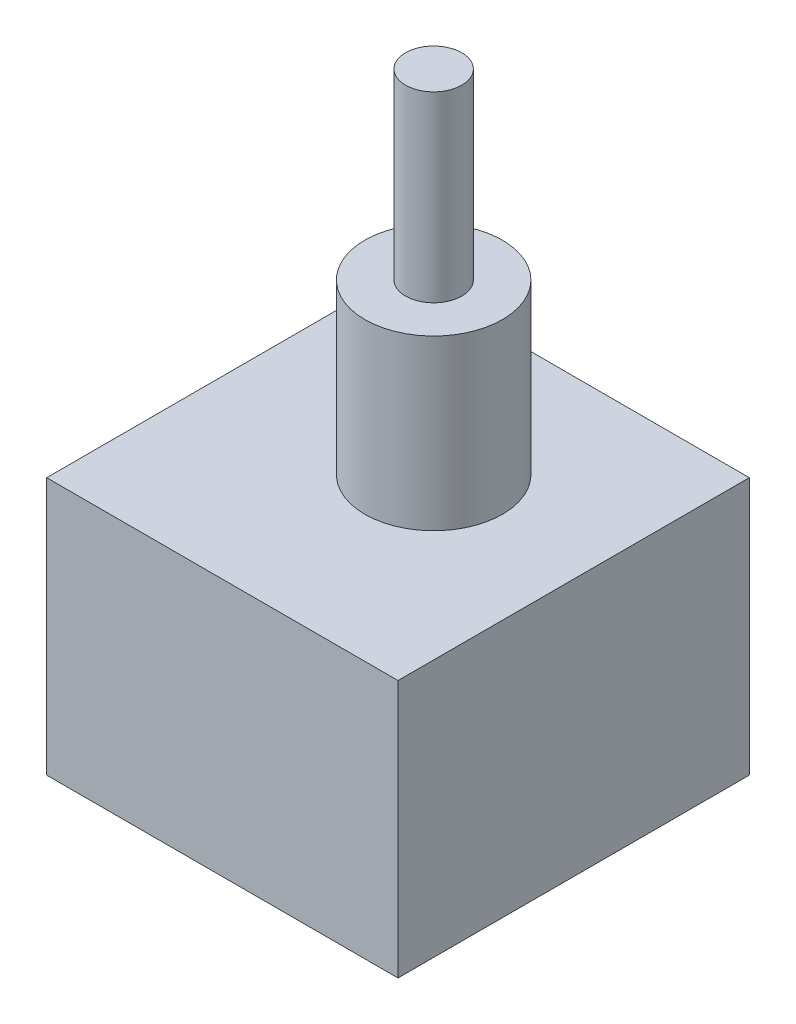
ISO-10303-21;
HEADER;
FILE_DESCRIPTION(('STEP AP214'),'2;1');
FILE_NAME('part.step','',(''),(''),'','','');
FILE_SCHEMA(('AUTOMOTIVE_DESIGN { 1 0 10303 214 1 1 1 1 }'));
ENDSEC;
DATA;
#1=APPLICATION_CONTEXT('core data for automotive mechanical design processes');
#2=APPLICATION_PROTOCOL_DEFINITION('international standard','automotive_design',2000,#1);
#3=PRODUCT_CONTEXT('',#1,'mechanical');
#4=PRODUCT('Part','Part','',(#3));
#5=PRODUCT_RELATED_PRODUCT_CATEGORY('part','',(#4));
#6=PRODUCT_DEFINITION_FORMATION('','',#4);
#7=PRODUCT_DEFINITION_CONTEXT('part definition',#1,'design');
#8=PRODUCT_DEFINITION('design','',#6,#7);
#9=PRODUCT_DEFINITION_SHAPE('','',#8);
#10=(LENGTH_UNIT() NAMED_UNIT(*) SI_UNIT(.MILLI.,.METRE.));
#11=(NAMED_UNIT(*) PLANE_ANGLE_UNIT() SI_UNIT($,.RADIAN.));
#12=(NAMED_UNIT(*) SI_UNIT($,.STERADIAN.) SOLID_ANGLE_UNIT());
#13=UNCERTAINTY_MEASURE_WITH_UNIT(LENGTH_MEASURE(1.E-05),#10,'distance_accuracy_value','');
#14=(GEOMETRIC_REPRESENTATION_CONTEXT(3) GLOBAL_UNCERTAINTY_ASSIGNED_CONTEXT((#13)) GLOBAL_UNIT_ASSIGNED_CONTEXT((#10,
#11,#12)) REPRESENTATION_CONTEXT('',''));
#15=CARTESIAN_POINT('',(0.,0.,0.));
#16=DIRECTION('',(0.,0.,1.));
#17=DIRECTION('',(1.,0.,0.));
#18=AXIS2_PLACEMENT_3D('',#15,#16,#17);
#19=CARTESIAN_POINT('',(-16.2944162436548,22.,-13.248730964467));
#20=DIRECTION('',(1.,0.,0.));
#21=DIRECTION('',(0.,0.,-1.));
#22=AXIS2_PLACEMENT_3D('',#19,#20,#21);
#23=PLANE('',#22);
#24=DIRECTION('',(0.,0.,1.));
#25=VECTOR('',#24,1.);
#26=CARTESIAN_POINT('',(-16.2944162436548,0.,-13.248730964467));
#27=LINE('',#26,#25);
#28=CARTESIAN_POINT('',(-16.2944162436548,0.,-13.248730964467));
#29=VERTEX_POINT('',#28);
#30=CARTESIAN_POINT('',(-16.2944162436548,0.,16.751269035533));
#31=VERTEX_POINT('',#30);
#32=EDGE_CURVE('E116',#29,#31,#27,.T.);
#33=ORIENTED_EDGE('',*,*,#32,.T.);
#34=DIRECTION('',(0.,-1.,0.));
#35=VECTOR('',#34,1.);
#36=CARTESIAN_POINT('',(-16.2944162436548,22.,16.751269035533));
#37=LINE('',#36,#35);
#38=CARTESIAN_POINT('',(-16.2944162436548,22.,16.751269035533));
#39=VERTEX_POINT('',#38);
#40=EDGE_CURVE('E47',#39,#31,#37,.T.);
#41=ORIENTED_EDGE('',*,*,#40,.F.);
#42=DIRECTION('',(0.,0.,1.));
#43=VECTOR('',#42,1.);
#44=CARTESIAN_POINT('',(-16.2944162436548,22.,-13.248730964467));
#45=LINE('',#44,#43);
#46=CARTESIAN_POINT('',(-16.2944162436548,22.,-13.248730964467));
#47=VERTEX_POINT('',#46);
#48=EDGE_CURVE('E99',#47,#39,#45,.T.);
#49=ORIENTED_EDGE('',*,*,#48,.F.);
#50=DIRECTION('',(0.,-1.,0.));
#51=VECTOR('',#50,1.);
#52=CARTESIAN_POINT('',(-16.2944162436548,22.,-13.248730964467));
#53=LINE('',#52,#51);
#54=EDGE_CURVE('E112',#47,#29,#53,.T.);
#55=ORIENTED_EDGE('',*,*,#54,.T.);
#56=EDGE_LOOP('',(#33,#41,#49,#55));
#57=FACE_BOUND('',#56,.T.);
#58=ADVANCED_FACE('F44',(#57),#23,.F.);
#59=CARTESIAN_POINT('',(-16.2944162436548,22.,16.751269035533));
#60=DIRECTION('',(0.,0.,-1.));
#61=DIRECTION('',(-1.,0.,0.));
#62=AXIS2_PLACEMENT_3D('',#59,#60,#61);
#63=PLANE('',#62);
#64=DIRECTION('',(1.,0.,0.));
#65=VECTOR('',#64,1.);
#66=CARTESIAN_POINT('',(-16.2944162436548,0.,16.751269035533));
#67=LINE('',#66,#65);
#68=CARTESIAN_POINT('',(13.7055837563452,0.,16.751269035533));
#69=VERTEX_POINT('',#68);
#70=EDGE_CURVE('E105',#31,#69,#67,.T.);
#71=ORIENTED_EDGE('',*,*,#70,.T.);
#72=DIRECTION('',(0.,-1.,0.));
#73=VECTOR('',#72,1.);
#74=CARTESIAN_POINT('',(13.7055837563452,22.,16.751269035533));
#75=LINE('',#74,#73);
#76=CARTESIAN_POINT('',(13.7055837563452,22.,16.751269035533));
#77=VERTEX_POINT('',#76);
#78=EDGE_CURVE('E103',#77,#69,#75,.T.);
#79=ORIENTED_EDGE('',*,*,#78,.F.);
#80=DIRECTION('',(1.,0.,0.));
#81=VECTOR('',#80,1.);
#82=CARTESIAN_POINT('',(-16.2944162436548,22.,16.751269035533));
#83=LINE('',#82,#81);
#84=EDGE_CURVE('E94',#39,#77,#83,.T.);
#85=ORIENTED_EDGE('',*,*,#84,.F.);
#86=ORIENTED_EDGE('',*,*,#40,.T.);
#87=EDGE_LOOP('',(#71,#79,#85,#86));
#88=FACE_BOUND('',#87,.T.);
#89=ADVANCED_FACE('F104',(#88),#63,.F.);
#90=CARTESIAN_POINT('',(13.7055837563452,22.,-13.248730964467));
#91=DIRECTION('',(-1.,0.,0.));
#92=DIRECTION('',(0.,0.,1.));
#93=AXIS2_PLACEMENT_3D('',#90,#91,#92);
#94=PLANE('',#93);
#95=DIRECTION('',(0.,0.,-1.));
#96=VECTOR('',#95,1.);
#97=CARTESIAN_POINT('',(13.7055837563452,0.,-13.248730964467));
#98=LINE('',#97,#96);
#99=CARTESIAN_POINT('',(13.7055837563452,0.,-13.248730964467));
#100=VERTEX_POINT('',#99);
#101=EDGE_CURVE('E80',#69,#100,#98,.T.);
#102=ORIENTED_EDGE('',*,*,#101,.T.);
#103=DIRECTION('',(0.,-1.,0.));
#104=VECTOR('',#103,1.);
#105=CARTESIAN_POINT('',(13.7055837563452,22.,-13.248730964467));
#106=LINE('',#105,#104);
#107=CARTESIAN_POINT('',(13.7055837563452,22.,-13.248730964467));
#108=VERTEX_POINT('',#107);
#109=EDGE_CURVE('E107',#108,#100,#106,.T.);
#110=ORIENTED_EDGE('',*,*,#109,.F.);
#111=DIRECTION('',(0.,0.,-1.));
#112=VECTOR('',#111,1.);
#113=CARTESIAN_POINT('',(13.7055837563452,22.,-13.248730964467));
#114=LINE('',#113,#112);
#115=EDGE_CURVE('E97',#77,#108,#114,.T.);
#116=ORIENTED_EDGE('',*,*,#115,.F.);
#117=ORIENTED_EDGE('',*,*,#78,.T.);
#118=EDGE_LOOP('',(#102,#110,#116,#117));
#119=FACE_BOUND('',#118,.T.);
#120=ADVANCED_FACE('F108',(#119),#94,.F.);
#121=CARTESIAN_POINT('',(-16.2944162436548,22.,-13.248730964467));
#122=DIRECTION('',(0.,0.,1.));
#123=DIRECTION('',(1.,0.,0.));
#124=AXIS2_PLACEMENT_3D('',#121,#122,#123);
#125=PLANE('',#124);
#126=DIRECTION('',(-1.,0.,0.));
#127=VECTOR('',#126,1.);
#128=CARTESIAN_POINT('',(-16.2944162436548,0.,-13.248730964467));
#129=LINE('',#128,#127);
#130=EDGE_CURVE('E86',#100,#29,#129,.T.);
#131=ORIENTED_EDGE('',*,*,#130,.T.);
#132=ORIENTED_EDGE('',*,*,#54,.F.);
#133=DIRECTION('',(-1.,0.,0.));
#134=VECTOR('',#133,1.);
#135=CARTESIAN_POINT('',(-16.2944162436548,22.,-13.248730964467));
#136=LINE('',#135,#134);
#137=EDGE_CURVE('E63',#108,#47,#136,.T.);
#138=ORIENTED_EDGE('',*,*,#137,.F.);
#139=ORIENTED_EDGE('',*,*,#109,.T.);
#140=EDGE_LOOP('',(#131,#132,#138,#139));
#141=FACE_BOUND('',#140,.T.);
#142=ADVANCED_FACE('F130',(#141),#125,.F.);
#143=CARTESIAN_POINT('',(0.,22.,0.));
#144=DIRECTION('',(0.,1.,0.));
#145=DIRECTION('',(0.,0.,1.));
#146=AXIS2_PLACEMENT_3D('',#143,#144,#145);
#147=PLANE('',#146);
#148=CARTESIAN_POINT('',(0.,22.,0.));
#149=DIRECTION('',(0.,1.,0.));
#150=DIRECTION('',(0.,0.,1.));
#151=AXIS2_PLACEMENT_3D('',#148,#149,#150);
#152=CIRCLE('',#151,5.875);
#153=CARTESIAN_POINT('',(0.,22.,5.875));
#154=VERTEX_POINT('',#153);
#155=EDGE_CURVE('E54',#154,#154,#152,.T.);
#156=ORIENTED_EDGE('',*,*,#155,.F.);
#157=EDGE_LOOP('',(#156));
#158=FACE_BOUND('',#157,.T.);
#159=ORIENTED_EDGE('',*,*,#48,.T.);
#160=ORIENTED_EDGE('',*,*,#84,.T.);
#161=ORIENTED_EDGE('',*,*,#115,.T.);
#162=ORIENTED_EDGE('',*,*,#137,.T.);
#163=EDGE_LOOP('',(#159,#160,#161,#162));
#164=FACE_BOUND('',#163,.T.);
#165=ADVANCED_FACE('F95',(#158,#164),#147,.T.);
#166=CARTESIAN_POINT('',(0.,0.,0.));
#167=DIRECTION('',(0.,1.,0.));
#168=DIRECTION('',(0.,0.,1.));
#169=AXIS2_PLACEMENT_3D('',#166,#167,#168);
#170=PLANE('',#169);
#171=CARTESIAN_POINT('',(7.,0.,0.));
#172=DIRECTION('',(0.,-1.,0.));
#173=DIRECTION('',(0.,0.,-1.));
#174=AXIS2_PLACEMENT_3D('',#171,#172,#173);
#175=CIRCLE('',#174,2.5);
#176=CARTESIAN_POINT('',(7.,0.,-2.5));
#177=VERTEX_POINT('',#176);
#178=EDGE_CURVE('E156',#177,#177,#175,.T.);
#179=ORIENTED_EDGE('',*,*,#178,.F.);
#180=EDGE_LOOP('',(#179));
#181=FACE_BOUND('',#180,.T.);
#182=CARTESIAN_POINT('',(-7.,0.,0.));
#183=DIRECTION('',(0.,-1.,0.));
#184=DIRECTION('',(0.,0.,1.));
#185=AXIS2_PLACEMENT_3D('',#182,#183,#184);
#186=CIRCLE('',#185,2.5);
#187=CARTESIAN_POINT('',(-7.,0.,2.5));
#188=VERTEX_POINT('',#187);
#189=EDGE_CURVE('E152',#188,#188,#186,.T.);
#190=ORIENTED_EDGE('',*,*,#189,.F.);
#191=EDGE_LOOP('',(#190));
#192=FACE_BOUND('',#191,.T.);
#193=ORIENTED_EDGE('',*,*,#32,.F.);
#194=ORIENTED_EDGE('',*,*,#130,.F.);
#195=ORIENTED_EDGE('',*,*,#101,.F.);
#196=ORIENTED_EDGE('',*,*,#70,.F.);
#197=EDGE_LOOP('',(#193,#194,#195,#196));
#198=FACE_BOUND('',#197,.T.);
#199=ADVANCED_FACE('F133',(#181,#192,#198),#170,.F.);
#200=CARTESIAN_POINT('',(0.,36.4,0.));
#201=DIRECTION('',(0.,-1.,0.));
#202=DIRECTION('',(0.,0.,-1.));
#203=AXIS2_PLACEMENT_3D('',#200,#201,#202);
#204=CYLINDRICAL_SURFACE('',#203,5.875);
#205=CARTESIAN_POINT('',(0.,36.4,0.));
#206=DIRECTION('',(0.,1.,0.));
#207=DIRECTION('',(0.,0.,1.));
#208=AXIS2_PLACEMENT_3D('',#205,#206,#207);
#209=CIRCLE('',#208,5.875);
#210=CARTESIAN_POINT('',(0.,36.4,5.875));
#211=VERTEX_POINT('',#210);
#212=EDGE_CURVE('E120',#211,#211,#209,.T.);
#213=ORIENTED_EDGE('',*,*,#212,.F.);
#214=EDGE_LOOP('',(#213));
#215=FACE_BOUND('',#214,.T.);
#216=ORIENTED_EDGE('',*,*,#155,.T.);
#217=EDGE_LOOP('',(#216));
#218=FACE_BOUND('',#217,.T.);
#219=ADVANCED_FACE('F175',(#215,#218),#204,.T.);
#220=CARTESIAN_POINT('',(0.,36.4,0.));
#221=DIRECTION('',(0.,1.,0.));
#222=DIRECTION('',(0.,0.,1.));
#223=AXIS2_PLACEMENT_3D('',#220,#221,#222);
#224=PLANE('',#223);
#225=CARTESIAN_POINT('',(0.,36.4,0.));
#226=DIRECTION('',(0.,1.,0.));
#227=DIRECTION('',(0.,0.,1.));
#228=AXIS2_PLACEMENT_3D('',#225,#226,#227);
#229=CIRCLE('',#228,2.4);
#230=CARTESIAN_POINT('',(0.,36.4,2.4));
#231=VERTEX_POINT('',#230);
#232=EDGE_CURVE('E11',#231,#231,#229,.T.);
#233=ORIENTED_EDGE('',*,*,#232,.F.);
#234=EDGE_LOOP('',(#233));
#235=FACE_BOUND('',#234,.T.);
#236=ORIENTED_EDGE('',*,*,#212,.T.);
#237=EDGE_LOOP('',(#236));
#238=FACE_BOUND('',#237,.T.);
#239=ADVANCED_FACE('F210',(#235,#238),#224,.T.);
#240=CARTESIAN_POINT('',(0.,52.,0.));
#241=DIRECTION('',(0.,-1.,0.));
#242=DIRECTION('',(0.,0.,-1.));
#243=AXIS2_PLACEMENT_3D('',#240,#241,#242);
#244=CYLINDRICAL_SURFACE('',#243,2.4);
#245=CARTESIAN_POINT('',(0.,52.,0.));
#246=DIRECTION('',(0.,1.,0.));
#247=DIRECTION('',(0.,0.,1.));
#248=AXIS2_PLACEMENT_3D('',#245,#246,#247);
#249=CIRCLE('',#248,2.4);
#250=CARTESIAN_POINT('',(0.,52.,2.4));
#251=VERTEX_POINT('',#250);
#252=EDGE_CURVE('E142',#251,#251,#249,.T.);
#253=ORIENTED_EDGE('',*,*,#252,.F.);
#254=EDGE_LOOP('',(#253));
#255=FACE_BOUND('',#254,.T.);
#256=ORIENTED_EDGE('',*,*,#232,.T.);
#257=EDGE_LOOP('',(#256));
#258=FACE_BOUND('',#257,.T.);
#259=ADVANCED_FACE('F190',(#255,#258),#244,.T.);
#260=CARTESIAN_POINT('',(0.,52.,0.));
#261=DIRECTION('',(0.,1.,0.));
#262=DIRECTION('',(0.,0.,1.));
#263=AXIS2_PLACEMENT_3D('',#260,#261,#262);
#264=PLANE('',#263);
#265=ORIENTED_EDGE('',*,*,#252,.T.);
#266=EDGE_LOOP('',(#265));
#267=FACE_BOUND('',#266,.T.);
#268=ADVANCED_FACE('F181',(#267),#264,.T.);
#269=CARTESIAN_POINT('',(-7.,15.,0.));
#270=DIRECTION('',(0.,-1.,0.));
#271=DIRECTION('',(0.,0.,-1.));
#272=AXIS2_PLACEMENT_3D('',#269,#270,#271);
#273=CYLINDRICAL_SURFACE('',#272,2.5);
#274=CARTESIAN_POINT('',(-7.,15.,0.));
#275=DIRECTION('',(0.,-1.,0.));
#276=DIRECTION('',(0.,0.,1.));
#277=AXIS2_PLACEMENT_3D('',#274,#275,#276);
#278=CIRCLE('',#277,2.5);
#279=CARTESIAN_POINT('',(-7.,15.,2.5));
#280=VERTEX_POINT('',#279);
#281=EDGE_CURVE('E148',#280,#280,#278,.T.);
#282=ORIENTED_EDGE('',*,*,#281,.F.);
#283=EDGE_LOOP('',(#282));
#284=FACE_BOUND('',#283,.T.);
#285=ORIENTED_EDGE('',*,*,#189,.T.);
#286=EDGE_LOOP('',(#285));
#287=FACE_BOUND('',#286,.T.);
#288=ADVANCED_FACE('F179',(#284,#287),#273,.F.);
#289=CARTESIAN_POINT('',(-7.,15.,0.));
#290=DIRECTION('',(0.,1.,0.));
#291=DIRECTION('',(0.,0.,1.));
#292=AXIS2_PLACEMENT_3D('',#289,#290,#291);
#293=PLANE('',#292);
#294=ORIENTED_EDGE('',*,*,#281,.T.);
#295=EDGE_LOOP('',(#294));
#296=FACE_BOUND('',#295,.T.);
#297=ADVANCED_FACE('F169',(#296),#293,.F.);
#298=CARTESIAN_POINT('',(7.,15.,0.));
#299=DIRECTION('',(0.,-1.,0.));
#300=DIRECTION('',(0.,0.,-1.));
#301=AXIS2_PLACEMENT_3D('',#298,#299,#300);
#302=CYLINDRICAL_SURFACE('',#301,2.5);
#303=CARTESIAN_POINT('',(7.,15.,0.));
#304=DIRECTION('',(0.,-1.,0.));
#305=DIRECTION('',(0.,0.,-1.));
#306=AXIS2_PLACEMENT_3D('',#303,#304,#305);
#307=CIRCLE('',#306,2.5);
#308=CARTESIAN_POINT('',(7.,15.,-2.5));
#309=VERTEX_POINT('',#308);
#310=EDGE_CURVE('E147',#309,#309,#307,.T.);
#311=ORIENTED_EDGE('',*,*,#310,.F.);
#312=EDGE_LOOP('',(#311));
#313=FACE_BOUND('',#312,.T.);
#314=ORIENTED_EDGE('',*,*,#178,.T.);
#315=EDGE_LOOP('',(#314));
#316=FACE_BOUND('',#315,.T.);
#317=ADVANCED_FACE('F166',(#313,#316),#302,.F.);
#318=CARTESIAN_POINT('',(7.,15.,0.));
#319=DIRECTION('',(0.,-1.,0.));
#320=DIRECTION('',(0.,0.,-1.));
#321=AXIS2_PLACEMENT_3D('',#318,#319,#320);
#322=PLANE('',#321);
#323=ORIENTED_EDGE('',*,*,#310,.T.);
#324=EDGE_LOOP('',(#323));
#325=FACE_BOUND('',#324,.T.);
#326=ADVANCED_FACE('F164',(#325),#322,.T.);
#327=CLOSED_SHELL('',(#58,#89,#120,#142,#165,#199,#219,#239,#259,#268,#288,#297,#317,#326));
#328=MANIFOLD_SOLID_BREP('B2',#327);
#329=ADVANCED_BREP_SHAPE_REPRESENTATION('',(#18,#328),#14);
#330=SHAPE_DEFINITION_REPRESENTATION(#9,#329);
ENDSEC;
END-ISO-10303-21;
